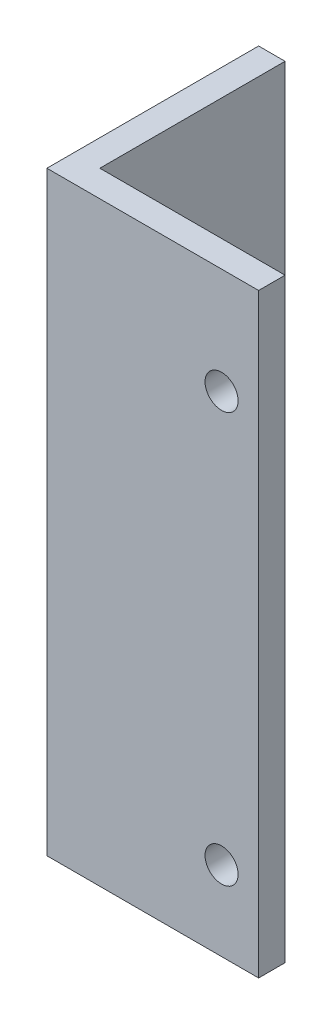
ISO-10303-21;
HEADER;
FILE_DESCRIPTION(('STEP AP214'),'2;1');
FILE_NAME('part.step','',(''),(''),'','','');
FILE_SCHEMA(('AUTOMOTIVE_DESIGN { 1 0 10303 214 1 1 1 1 }'));
ENDSEC;
DATA;
#1=APPLICATION_CONTEXT('core data for automotive mechanical design processes');
#2=APPLICATION_PROTOCOL_DEFINITION('international standard','automotive_design',2000,#1);
#3=PRODUCT_CONTEXT('',#1,'mechanical');
#4=PRODUCT('Part','Part','',(#3));
#5=PRODUCT_RELATED_PRODUCT_CATEGORY('part','',(#4));
#6=PRODUCT_DEFINITION_FORMATION('','',#4);
#7=PRODUCT_DEFINITION_CONTEXT('part definition',#1,'design');
#8=PRODUCT_DEFINITION('design','',#6,#7);
#9=PRODUCT_DEFINITION_SHAPE('','',#8);
#10=(LENGTH_UNIT() NAMED_UNIT(*) SI_UNIT(.MILLI.,.METRE.));
#11=(NAMED_UNIT(*) PLANE_ANGLE_UNIT() SI_UNIT($,.RADIAN.));
#12=(NAMED_UNIT(*) SI_UNIT($,.STERADIAN.) SOLID_ANGLE_UNIT());
#13=UNCERTAINTY_MEASURE_WITH_UNIT(LENGTH_MEASURE(1.E-05),#10,'distance_accuracy_value','');
#14=(GEOMETRIC_REPRESENTATION_CONTEXT(3) GLOBAL_UNCERTAINTY_ASSIGNED_CONTEXT((#13)) GLOBAL_UNIT_ASSIGNED_CONTEXT((#10,
#11,#12)) REPRESENTATION_CONTEXT('',''));
#15=CARTESIAN_POINT('',(0.,0.,0.));
#16=DIRECTION('',(0.,0.,1.));
#17=DIRECTION('',(1.,0.,0.));
#18=AXIS2_PLACEMENT_3D('',#15,#16,#17);
#19=CARTESIAN_POINT('',(0.,45.,-16.));
#20=DIRECTION('',(1.,0.,0.));
#21=DIRECTION('',(0.,0.,-1.));
#22=AXIS2_PLACEMENT_3D('',#19,#20,#21);
#23=PLANE('',#22);
#24=CARTESIAN_POINT('',(0.,9.5,-13.));
#25=DIRECTION('',(1.,0.,0.));
#26=DIRECTION('',(0.,0.,-1.));
#27=AXIS2_PLACEMENT_3D('',#24,#25,#26);
#28=CIRCLE('',#27,1.25);
#29=CARTESIAN_POINT('',(0.,9.5,-14.25));
#30=VERTEX_POINT('',#29);
#31=EDGE_CURVE('E184',#30,#30,#28,.T.);
#32=ORIENTED_EDGE('',*,*,#31,.T.);
#33=EDGE_LOOP('',(#32));
#34=FACE_BOUND('',#33,.T.);
#35=CARTESIAN_POINT('',(0.,13.5,-5.));
#36=DIRECTION('',(1.,0.,0.));
#37=DIRECTION('',(0.,0.,-1.));
#38=AXIS2_PLACEMENT_3D('',#35,#36,#37);
#39=CIRCLE('',#38,1.25);
#40=CARTESIAN_POINT('',(0.,13.5,-6.25));
#41=VERTEX_POINT('',#40);
#42=EDGE_CURVE('E187',#41,#41,#39,.T.);
#43=ORIENTED_EDGE('',*,*,#42,.T.);
#44=EDGE_LOOP('',(#43));
#45=FACE_BOUND('',#44,.T.);
#46=DIRECTION('',(0.,0.,1.));
#47=VECTOR('',#46,1.);
#48=CARTESIAN_POINT('',(0.,0.,-16.));
#49=LINE('',#48,#47);
#50=CARTESIAN_POINT('',(0.,0.,-16.));
#51=VERTEX_POINT('',#50);
#52=CARTESIAN_POINT('',(0.,0.,0.));
#53=VERTEX_POINT('',#52);
#54=EDGE_CURVE('E127',#51,#53,#49,.T.);
#55=ORIENTED_EDGE('',*,*,#54,.T.);
#56=DIRECTION('',(0.,-1.,0.));
#57=VECTOR('',#56,1.);
#58=CARTESIAN_POINT('',(0.,45.,0.));
#59=LINE('',#58,#57);
#60=CARTESIAN_POINT('',(0.,45.,0.));
#61=VERTEX_POINT('',#60);
#62=EDGE_CURVE('E11',#61,#53,#59,.T.);
#63=ORIENTED_EDGE('',*,*,#62,.F.);
#64=DIRECTION('',(0.,0.,1.));
#65=VECTOR('',#64,1.);
#66=CARTESIAN_POINT('',(0.,45.,-16.));
#67=LINE('',#66,#65);
#68=CARTESIAN_POINT('',(0.,45.,-16.));
#69=VERTEX_POINT('',#68);
#70=EDGE_CURVE('E144',#69,#61,#67,.T.);
#71=ORIENTED_EDGE('',*,*,#70,.F.);
#72=DIRECTION('',(0.,-1.,0.));
#73=VECTOR('',#72,1.);
#74=CARTESIAN_POINT('',(0.,45.,-16.));
#75=LINE('',#74,#73);
#76=EDGE_CURVE('E123',#69,#51,#75,.T.);
#77=ORIENTED_EDGE('',*,*,#76,.T.);
#78=EDGE_LOOP('',(#55,#63,#71,#77));
#79=FACE_BOUND('',#78,.T.);
#80=ADVANCED_FACE('F38',(#34,#45,#79),#23,.F.);
#81=CARTESIAN_POINT('',(0.,45.,0.));
#82=DIRECTION('',(0.,0.,-1.));
#83=DIRECTION('',(-1.,0.,0.));
#84=AXIS2_PLACEMENT_3D('',#81,#82,#83);
#85=PLANE('',#84);
#86=CARTESIAN_POINT('',(13.2,37.,0.));
#87=DIRECTION('',(0.,0.,-1.));
#88=DIRECTION('',(-1.,0.,0.));
#89=AXIS2_PLACEMENT_3D('',#86,#87,#88);
#90=CIRCLE('',#89,1.25);
#91=CARTESIAN_POINT('',(11.95,37.,0.));
#92=VERTEX_POINT('',#91);
#93=EDGE_CURVE('E132',#92,#92,#90,.T.);
#94=ORIENTED_EDGE('',*,*,#93,.T.);
#95=EDGE_LOOP('',(#94));
#96=FACE_BOUND('',#95,.T.);
#97=CARTESIAN_POINT('',(13.2,6.,0.));
#98=DIRECTION('',(0.,0.,-1.));
#99=DIRECTION('',(-1.,0.,0.));
#100=AXIS2_PLACEMENT_3D('',#97,#98,#99);
#101=CIRCLE('',#100,1.25);
#102=CARTESIAN_POINT('',(11.95,6.,0.));
#103=VERTEX_POINT('',#102);
#104=EDGE_CURVE('E208',#103,#103,#101,.T.);
#105=ORIENTED_EDGE('',*,*,#104,.T.);
#106=EDGE_LOOP('',(#105));
#107=FACE_BOUND('',#106,.T.);
#108=DIRECTION('',(1.,0.,0.));
#109=VECTOR('',#108,1.);
#110=CARTESIAN_POINT('',(0.,0.,0.));
#111=LINE('',#110,#109);
#112=CARTESIAN_POINT('',(16.,0.,0.));
#113=VERTEX_POINT('',#112);
#114=EDGE_CURVE('E131',#53,#113,#111,.T.);
#115=ORIENTED_EDGE('',*,*,#114,.T.);
#116=DIRECTION('',(0.,-1.,0.));
#117=VECTOR('',#116,1.);
#118=CARTESIAN_POINT('',(16.,45.,0.));
#119=LINE('',#118,#117);
#120=CARTESIAN_POINT('',(16.,45.,0.));
#121=VERTEX_POINT('',#120);
#122=EDGE_CURVE('E47',#121,#113,#119,.T.);
#123=ORIENTED_EDGE('',*,*,#122,.F.);
#124=DIRECTION('',(1.,0.,0.));
#125=VECTOR('',#124,1.);
#126=CARTESIAN_POINT('',(0.,45.,0.));
#127=LINE('',#126,#125);
#128=EDGE_CURVE('E92',#61,#121,#127,.T.);
#129=ORIENTED_EDGE('',*,*,#128,.F.);
#130=ORIENTED_EDGE('',*,*,#62,.T.);
#131=EDGE_LOOP('',(#115,#123,#129,#130));
#132=FACE_BOUND('',#131,.T.);
#133=ADVANCED_FACE('F174',(#96,#107,#132),#85,.F.);
#134=CARTESIAN_POINT('',(16.,45.,0.));
#135=DIRECTION('',(-1.,0.,0.));
#136=DIRECTION('',(0.,0.,1.));
#137=AXIS2_PLACEMENT_3D('',#134,#135,#136);
#138=PLANE('',#137);
#139=DIRECTION('',(0.,0.,-1.));
#140=VECTOR('',#139,1.);
#141=CARTESIAN_POINT('',(16.,0.,0.));
#142=LINE('',#141,#140);
#143=CARTESIAN_POINT('',(16.,0.,-2.));
#144=VERTEX_POINT('',#143);
#145=EDGE_CURVE('E135',#113,#144,#142,.T.);
#146=ORIENTED_EDGE('',*,*,#145,.T.);
#147=DIRECTION('',(0.,-1.,0.));
#148=VECTOR('',#147,1.);
#149=CARTESIAN_POINT('',(16.,45.,-2.));
#150=LINE('',#149,#148);
#151=CARTESIAN_POINT('',(16.,45.,-2.));
#152=VERTEX_POINT('',#151);
#153=EDGE_CURVE('E116',#152,#144,#150,.T.);
#154=ORIENTED_EDGE('',*,*,#153,.F.);
#155=DIRECTION('',(0.,0.,-1.));
#156=VECTOR('',#155,1.);
#157=CARTESIAN_POINT('',(16.,45.,0.));
#158=LINE('',#157,#156);
#159=EDGE_CURVE('E105',#121,#152,#158,.T.);
#160=ORIENTED_EDGE('',*,*,#159,.F.);
#161=ORIENTED_EDGE('',*,*,#122,.T.);
#162=EDGE_LOOP('',(#146,#154,#160,#161));
#163=FACE_BOUND('',#162,.T.);
#164=ADVANCED_FACE('F154',(#163),#138,.F.);
#165=CARTESIAN_POINT('',(16.,45.,-2.));
#166=DIRECTION('',(0.,0.,1.));
#167=DIRECTION('',(1.,0.,0.));
#168=AXIS2_PLACEMENT_3D('',#165,#166,#167);
#169=PLANE('',#168);
#170=CARTESIAN_POINT('',(13.2,37.,-2.));
#171=DIRECTION('',(0.,0.,-1.));
#172=DIRECTION('',(-1.,0.,0.));
#173=AXIS2_PLACEMENT_3D('',#170,#171,#172);
#174=CIRCLE('',#173,1.25);
#175=CARTESIAN_POINT('',(11.95,37.,-2.));
#176=VERTEX_POINT('',#175);
#177=EDGE_CURVE('E204',#176,#176,#174,.T.);
#178=ORIENTED_EDGE('',*,*,#177,.F.);
#179=EDGE_LOOP('',(#178));
#180=FACE_BOUND('',#179,.T.);
#181=CARTESIAN_POINT('',(13.2,6.,-2.));
#182=DIRECTION('',(0.,0.,-1.));
#183=DIRECTION('',(-1.,0.,0.));
#184=AXIS2_PLACEMENT_3D('',#181,#182,#183);
#185=CIRCLE('',#184,1.25);
#186=CARTESIAN_POINT('',(11.95,6.,-2.));
#187=VERTEX_POINT('',#186);
#188=EDGE_CURVE('E212',#187,#187,#185,.T.);
#189=ORIENTED_EDGE('',*,*,#188,.F.);
#190=EDGE_LOOP('',(#189));
#191=FACE_BOUND('',#190,.T.);
#192=DIRECTION('',(-1.,0.,0.));
#193=VECTOR('',#192,1.);
#194=CARTESIAN_POINT('',(16.,0.,-2.));
#195=LINE('',#194,#193);
#196=CARTESIAN_POINT('',(2.,0.,-2.));
#197=VERTEX_POINT('',#196);
#198=EDGE_CURVE('E114',#144,#197,#195,.T.);
#199=ORIENTED_EDGE('',*,*,#198,.T.);
#200=DIRECTION('',(0.,-1.,0.));
#201=VECTOR('',#200,1.);
#202=CARTESIAN_POINT('',(2.,45.,-2.));
#203=LINE('',#202,#201);
#204=CARTESIAN_POINT('',(2.,45.,-2.));
#205=VERTEX_POINT('',#204);
#206=EDGE_CURVE('E111',#205,#197,#203,.T.);
#207=ORIENTED_EDGE('',*,*,#206,.F.);
#208=DIRECTION('',(-1.,0.,0.));
#209=VECTOR('',#208,1.);
#210=CARTESIAN_POINT('',(16.,45.,-2.));
#211=LINE('',#210,#209);
#212=EDGE_CURVE('E99',#152,#205,#211,.T.);
#213=ORIENTED_EDGE('',*,*,#212,.F.);
#214=ORIENTED_EDGE('',*,*,#153,.T.);
#215=EDGE_LOOP('',(#199,#207,#213,#214));
#216=FACE_BOUND('',#215,.T.);
#217=ADVANCED_FACE('F112',(#180,#191,#216),#169,.F.);
#218=CARTESIAN_POINT('',(2.,45.,-2.));
#219=DIRECTION('',(-1.,0.,0.));
#220=DIRECTION('',(0.,0.,1.));
#221=AXIS2_PLACEMENT_3D('',#218,#219,#220);
#222=PLANE('',#221);
#223=CARTESIAN_POINT('',(2.,9.5,-13.));
#224=DIRECTION('',(1.,0.,0.));
#225=DIRECTION('',(0.,0.,-1.));
#226=AXIS2_PLACEMENT_3D('',#223,#224,#225);
#227=CIRCLE('',#226,1.25);
#228=CARTESIAN_POINT('',(2.,9.5,-14.25));
#229=VERTEX_POINT('',#228);
#230=EDGE_CURVE('E190',#229,#229,#227,.T.);
#231=ORIENTED_EDGE('',*,*,#230,.F.);
#232=EDGE_LOOP('',(#231));
#233=FACE_BOUND('',#232,.T.);
#234=CARTESIAN_POINT('',(2.,13.5,-5.));
#235=DIRECTION('',(1.,0.,0.));
#236=DIRECTION('',(0.,0.,-1.));
#237=AXIS2_PLACEMENT_3D('',#234,#235,#236);
#238=CIRCLE('',#237,1.25);
#239=CARTESIAN_POINT('',(2.,13.5,-6.25));
#240=VERTEX_POINT('',#239);
#241=EDGE_CURVE('E191',#240,#240,#238,.T.);
#242=ORIENTED_EDGE('',*,*,#241,.F.);
#243=EDGE_LOOP('',(#242));
#244=FACE_BOUND('',#243,.T.);
#245=DIRECTION('',(0.,0.,-1.));
#246=VECTOR('',#245,1.);
#247=CARTESIAN_POINT('',(2.,0.,-2.));
#248=LINE('',#247,#246);
#249=CARTESIAN_POINT('',(2.,0.,-16.));
#250=VERTEX_POINT('',#249);
#251=EDGE_CURVE('E78',#197,#250,#248,.T.);
#252=ORIENTED_EDGE('',*,*,#251,.T.);
#253=DIRECTION('',(0.,-1.,0.));
#254=VECTOR('',#253,1.);
#255=CARTESIAN_POINT('',(2.,45.,-16.));
#256=LINE('',#255,#254);
#257=CARTESIAN_POINT('',(2.,45.,-16.));
#258=VERTEX_POINT('',#257);
#259=EDGE_CURVE('E117',#258,#250,#256,.T.);
#260=ORIENTED_EDGE('',*,*,#259,.F.);
#261=DIRECTION('',(0.,0.,-1.));
#262=VECTOR('',#261,1.);
#263=CARTESIAN_POINT('',(2.,45.,-2.));
#264=LINE('',#263,#262);
#265=EDGE_CURVE('E103',#205,#258,#264,.T.);
#266=ORIENTED_EDGE('',*,*,#265,.F.);
#267=ORIENTED_EDGE('',*,*,#206,.T.);
#268=EDGE_LOOP('',(#252,#260,#266,#267));
#269=FACE_BOUND('',#268,.T.);
#270=ADVANCED_FACE('F119',(#233,#244,#269),#222,.F.);
#271=CARTESIAN_POINT('',(2.,45.,-16.));
#272=DIRECTION('',(0.,0.,1.));
#273=DIRECTION('',(1.,0.,0.));
#274=AXIS2_PLACEMENT_3D('',#271,#272,#273);
#275=PLANE('',#274);
#276=DIRECTION('',(-1.,0.,0.));
#277=VECTOR('',#276,1.);
#278=CARTESIAN_POINT('',(2.,0.,-16.));
#279=LINE('',#278,#277);
#280=EDGE_CURVE('E84',#250,#51,#279,.T.);
#281=ORIENTED_EDGE('',*,*,#280,.T.);
#282=ORIENTED_EDGE('',*,*,#76,.F.);
#283=DIRECTION('',(-1.,0.,0.));
#284=VECTOR('',#283,1.);
#285=CARTESIAN_POINT('',(2.,45.,-16.));
#286=LINE('',#285,#284);
#287=EDGE_CURVE('E55',#258,#69,#286,.T.);
#288=ORIENTED_EDGE('',*,*,#287,.F.);
#289=ORIENTED_EDGE('',*,*,#259,.T.);
#290=EDGE_LOOP('',(#281,#282,#288,#289));
#291=FACE_BOUND('',#290,.T.);
#292=ADVANCED_FACE('F161',(#291),#275,.F.);
#293=CARTESIAN_POINT('',(0.,45.,0.));
#294=DIRECTION('',(0.,1.,0.));
#295=DIRECTION('',(0.,0.,1.));
#296=AXIS2_PLACEMENT_3D('',#293,#294,#295);
#297=PLANE('',#296);
#298=ORIENTED_EDGE('',*,*,#70,.T.);
#299=ORIENTED_EDGE('',*,*,#128,.T.);
#300=ORIENTED_EDGE('',*,*,#159,.T.);
#301=ORIENTED_EDGE('',*,*,#212,.T.);
#302=ORIENTED_EDGE('',*,*,#265,.T.);
#303=ORIENTED_EDGE('',*,*,#287,.T.);
#304=EDGE_LOOP('',(#298,#299,#300,#301,#302,#303));
#305=FACE_BOUND('',#304,.T.);
#306=ADVANCED_FACE('F101',(#305),#297,.T.);
#307=CARTESIAN_POINT('',(0.,0.,0.));
#308=DIRECTION('',(0.,1.,0.));
#309=DIRECTION('',(0.,0.,1.));
#310=AXIS2_PLACEMENT_3D('',#307,#308,#309);
#311=PLANE('',#310);
#312=ORIENTED_EDGE('',*,*,#54,.F.);
#313=ORIENTED_EDGE('',*,*,#280,.F.);
#314=ORIENTED_EDGE('',*,*,#251,.F.);
#315=ORIENTED_EDGE('',*,*,#198,.F.);
#316=ORIENTED_EDGE('',*,*,#145,.F.);
#317=ORIENTED_EDGE('',*,*,#114,.F.);
#318=EDGE_LOOP('',(#312,#313,#314,#315,#316,#317));
#319=FACE_BOUND('',#318,.T.);
#320=ADVANCED_FACE('F157',(#319),#311,.F.);
#321=CARTESIAN_POINT('',(13.2,6.,0.));
#322=DIRECTION('',(0.,0.,-1.));
#323=DIRECTION('',(-1.,0.,0.));
#324=AXIS2_PLACEMENT_3D('',#321,#322,#323);
#325=CYLINDRICAL_SURFACE('',#324,1.25);
#326=ORIENTED_EDGE('',*,*,#104,.F.);
#327=EDGE_LOOP('',(#326));
#328=FACE_BOUND('',#327,.T.);
#329=ORIENTED_EDGE('',*,*,#188,.T.);
#330=EDGE_LOOP('',(#329));
#331=FACE_BOUND('',#330,.T.);
#332=ADVANCED_FACE('F223',(#328,#331),#325,.F.);
#333=CARTESIAN_POINT('',(13.2,37.,0.));
#334=DIRECTION('',(0.,0.,-1.));
#335=DIRECTION('',(-1.,0.,0.));
#336=AXIS2_PLACEMENT_3D('',#333,#334,#335);
#337=CYLINDRICAL_SURFACE('',#336,1.25);
#338=ORIENTED_EDGE('',*,*,#93,.F.);
#339=EDGE_LOOP('',(#338));
#340=FACE_BOUND('',#339,.T.);
#341=ORIENTED_EDGE('',*,*,#177,.T.);
#342=EDGE_LOOP('',(#341));
#343=FACE_BOUND('',#342,.T.);
#344=ADVANCED_FACE('F234',(#340,#343),#337,.F.);
#345=CARTESIAN_POINT('',(0.,13.5,-5.));
#346=DIRECTION('',(1.,0.,0.));
#347=DIRECTION('',(0.,0.,-1.));
#348=AXIS2_PLACEMENT_3D('',#345,#346,#347);
#349=CYLINDRICAL_SURFACE('',#348,1.25);
#350=ORIENTED_EDGE('',*,*,#42,.F.);
#351=EDGE_LOOP('',(#350));
#352=FACE_BOUND('',#351,.T.);
#353=ORIENTED_EDGE('',*,*,#241,.T.);
#354=EDGE_LOOP('',(#353));
#355=FACE_BOUND('',#354,.T.);
#356=ADVANCED_FACE('F236',(#352,#355),#349,.F.);
#357=CARTESIAN_POINT('',(0.,9.5,-13.));
#358=DIRECTION('',(1.,0.,0.));
#359=DIRECTION('',(0.,0.,-1.));
#360=AXIS2_PLACEMENT_3D('',#357,#358,#359);
#361=CYLINDRICAL_SURFACE('',#360,1.25);
#362=ORIENTED_EDGE('',*,*,#31,.F.);
#363=EDGE_LOOP('',(#362));
#364=FACE_BOUND('',#363,.T.);
#365=ORIENTED_EDGE('',*,*,#230,.T.);
#366=EDGE_LOOP('',(#365));
#367=FACE_BOUND('',#366,.T.);
#368=ADVANCED_FACE('F242',(#364,#367),#361,.F.);
#369=CLOSED_SHELL('',(#80,#133,#164,#217,#270,#292,#306,#320,#332,#344,#356,#368));
#370=MANIFOLD_SOLID_BREP('B2',#369);
#371=ADVANCED_BREP_SHAPE_REPRESENTATION('',(#18,#370),#14);
#372=SHAPE_DEFINITION_REPRESENTATION(#9,#371);
ENDSEC;
END-ISO-10303-21;
